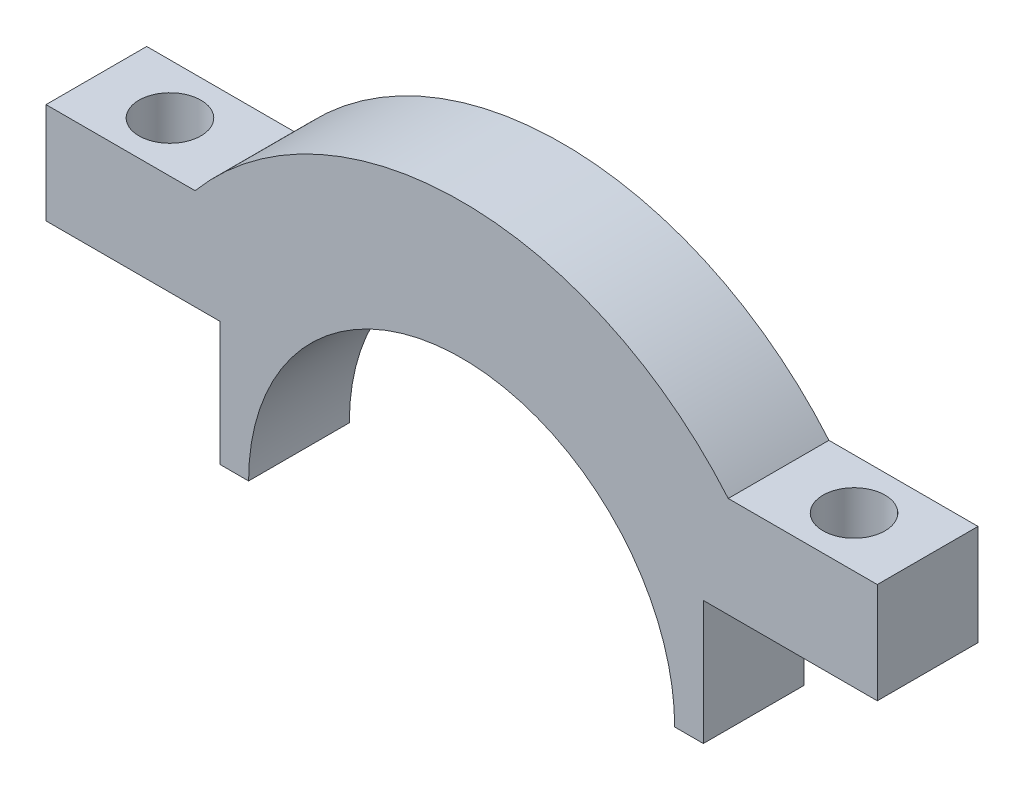
ISO-10303-21;
HEADER;
FILE_DESCRIPTION(('STEP AP214'),'2;1');
FILE_NAME('part.step','',(''),(''),'','','');
FILE_SCHEMA(('AUTOMOTIVE_DESIGN { 1 0 10303 214 1 1 1 1 }'));
ENDSEC;
DATA;
#1=APPLICATION_CONTEXT('core data for automotive mechanical design processes');
#2=APPLICATION_PROTOCOL_DEFINITION('international standard','automotive_design',2000,#1);
#3=PRODUCT_CONTEXT('',#1,'mechanical');
#4=PRODUCT('Part','Part','',(#3));
#5=PRODUCT_RELATED_PRODUCT_CATEGORY('part','',(#4));
#6=PRODUCT_DEFINITION_FORMATION('','',#4);
#7=PRODUCT_DEFINITION_CONTEXT('part definition',#1,'design');
#8=PRODUCT_DEFINITION('design','',#6,#7);
#9=PRODUCT_DEFINITION_SHAPE('','',#8);
#10=(LENGTH_UNIT() NAMED_UNIT(*) SI_UNIT(.MILLI.,.METRE.));
#11=(NAMED_UNIT(*) PLANE_ANGLE_UNIT() SI_UNIT($,.RADIAN.));
#12=(NAMED_UNIT(*) SI_UNIT($,.STERADIAN.) SOLID_ANGLE_UNIT());
#13=UNCERTAINTY_MEASURE_WITH_UNIT(LENGTH_MEASURE(1.E-05),#10,'distance_accuracy_value','');
#14=(GEOMETRIC_REPRESENTATION_CONTEXT(3) GLOBAL_UNCERTAINTY_ASSIGNED_CONTEXT((#13)) GLOBAL_UNIT_ASSIGNED_CONTEXT((#10,
#11,#12)) REPRESENTATION_CONTEXT('',''));
#15=CARTESIAN_POINT('',(0.,0.,0.));
#16=DIRECTION('',(0.,0.,1.));
#17=DIRECTION('',(1.,0.,0.));
#18=AXIS2_PLACEMENT_3D('',#15,#16,#17);
#19=CARTESIAN_POINT('',(0.,0.,-13.));
#20=DIRECTION('',(0.,0.,1.));
#21=DIRECTION('',(1.,0.,0.));
#22=AXIS2_PLACEMENT_3D('',#19,#20,#21);
#23=CYLINDRICAL_SURFACE('',#22,27.5);
#24=CARTESIAN_POINT('',(0.,0.,0.));
#25=DIRECTION('',(0.,0.,-1.));
#26=DIRECTION('',(1.,0.,0.));
#27=AXIS2_PLACEMENT_3D('',#24,#25,#26);
#28=CIRCLE('',#27,27.5);
#29=CARTESIAN_POINT('',(-27.5,0.,0.));
#30=VERTEX_POINT('',#29);
#31=CARTESIAN_POINT('',(27.5,0.,0.));
#32=VERTEX_POINT('',#31);
#33=EDGE_CURVE('E162',#30,#32,#28,.T.);
#34=ORIENTED_EDGE('',*,*,#33,.F.);
#35=DIRECTION('',(0.,0.,1.));
#36=VECTOR('',#35,1.);
#37=CARTESIAN_POINT('',(-27.5,0.,-13.));
#38=LINE('',#37,#36);
#39=CARTESIAN_POINT('',(-27.5,0.,-13.));
#40=VERTEX_POINT('',#39);
#41=EDGE_CURVE('E11',#40,#30,#38,.T.);
#42=ORIENTED_EDGE('',*,*,#41,.F.);
#43=CARTESIAN_POINT('',(0.,0.,-13.));
#44=DIRECTION('',(0.,0.,-1.));
#45=DIRECTION('',(1.,0.,0.));
#46=AXIS2_PLACEMENT_3D('',#43,#44,#45);
#47=CIRCLE('',#46,27.5);
#48=CARTESIAN_POINT('',(27.5,0.,-13.));
#49=VERTEX_POINT('',#48);
#50=EDGE_CURVE('E195',#40,#49,#47,.T.);
#51=ORIENTED_EDGE('',*,*,#50,.T.);
#52=DIRECTION('',(0.,0.,1.));
#53=VECTOR('',#52,1.);
#54=CARTESIAN_POINT('',(27.5,0.,-13.));
#55=LINE('',#54,#53);
#56=EDGE_CURVE('E44',#49,#32,#55,.T.);
#57=ORIENTED_EDGE('',*,*,#56,.T.);
#58=EDGE_LOOP('',(#34,#42,#51,#57));
#59=FACE_BOUND('',#58,.T.);
#60=ADVANCED_FACE('F41',(#59),#23,.F.);
#61=CARTESIAN_POINT('',(-27.5,0.,-13.));
#62=DIRECTION('',(0.,-1.,0.));
#63=DIRECTION('',(1.,0.,0.));
#64=AXIS2_PLACEMENT_3D('',#61,#62,#63);
#65=PLANE('',#64);
#66=DIRECTION('',(1.,0.,0.));
#67=VECTOR('',#66,1.);
#68=CARTESIAN_POINT('',(-27.5,0.,0.));
#69=LINE('',#68,#67);
#70=CARTESIAN_POINT('',(-31.2,0.,0.));
#71=VERTEX_POINT('',#70);
#72=EDGE_CURVE('E193',#71,#30,#69,.T.);
#73=ORIENTED_EDGE('',*,*,#72,.F.);
#74=DIRECTION('',(0.,0.,1.));
#75=VECTOR('',#74,1.);
#76=CARTESIAN_POINT('',(-31.2,0.,-13.));
#77=LINE('',#76,#75);
#78=CARTESIAN_POINT('',(-31.2,0.,-13.));
#79=VERTEX_POINT('',#78);
#80=EDGE_CURVE('E50',#79,#71,#77,.T.);
#81=ORIENTED_EDGE('',*,*,#80,.F.);
#82=DIRECTION('',(1.,0.,0.));
#83=VECTOR('',#82,1.);
#84=CARTESIAN_POINT('',(-27.5,0.,-13.));
#85=LINE('',#84,#83);
#86=EDGE_CURVE('E152',#79,#40,#85,.T.);
#87=ORIENTED_EDGE('',*,*,#86,.T.);
#88=ORIENTED_EDGE('',*,*,#41,.T.);
#89=EDGE_LOOP('',(#73,#81,#87,#88));
#90=FACE_BOUND('',#89,.T.);
#91=ADVANCED_FACE('F215',(#90),#65,.T.);
#92=CARTESIAN_POINT('',(-31.2,0.,-13.));
#93=DIRECTION('',(-1.,0.,0.));
#94=DIRECTION('',(0.,0.,1.));
#95=AXIS2_PLACEMENT_3D('',#92,#93,#94);
#96=PLANE('',#95);
#97=DIRECTION('',(0.,-1.,0.));
#98=VECTOR('',#97,1.);
#99=CARTESIAN_POINT('',(-31.2,0.,0.));
#100=LINE('',#99,#98);
#101=CARTESIAN_POINT('',(-31.2,16.,0.));
#102=VERTEX_POINT('',#101);
#103=EDGE_CURVE('E139',#102,#71,#100,.T.);
#104=ORIENTED_EDGE('',*,*,#103,.F.);
#105=DIRECTION('',(0.,0.,1.));
#106=VECTOR('',#105,1.);
#107=CARTESIAN_POINT('',(-31.2,16.,-13.));
#108=LINE('',#107,#106);
#109=CARTESIAN_POINT('',(-31.2,16.,-13.));
#110=VERTEX_POINT('',#109);
#111=EDGE_CURVE('E134',#110,#102,#108,.T.);
#112=ORIENTED_EDGE('',*,*,#111,.F.);
#113=DIRECTION('',(0.,-1.,0.));
#114=VECTOR('',#113,1.);
#115=CARTESIAN_POINT('',(-31.2,0.,-13.));
#116=LINE('',#115,#114);
#117=EDGE_CURVE('E137',#110,#79,#116,.T.);
#118=ORIENTED_EDGE('',*,*,#117,.T.);
#119=ORIENTED_EDGE('',*,*,#80,.T.);
#120=EDGE_LOOP('',(#104,#112,#118,#119));
#121=FACE_BOUND('',#120,.T.);
#122=ADVANCED_FACE('F136',(#121),#96,.T.);
#123=CARTESIAN_POINT('',(-31.2,16.,-13.));
#124=DIRECTION('',(0.,-1.,0.));
#125=DIRECTION('',(1.,0.,0.));
#126=AXIS2_PLACEMENT_3D('',#123,#124,#125);
#127=PLANE('',#126);
#128=CARTESIAN_POINT('',(-44.15,16.,-6.5));
#129=DIRECTION('',(0.,-1.,0.));
#130=DIRECTION('',(1.,0.,0.));
#131=AXIS2_PLACEMENT_3D('',#128,#129,#130);
#132=CIRCLE('',#131,4.00000000000001);
#133=CARTESIAN_POINT('',(-40.15,16.,-6.5));
#134=VERTEX_POINT('',#133);
#135=EDGE_CURVE('E166',#134,#134,#132,.F.);
#136=ORIENTED_EDGE('',*,*,#135,.T.);
#137=EDGE_LOOP('',(#136));
#138=FACE_BOUND('',#137,.T.);
#139=DIRECTION('',(1.,0.,0.));
#140=VECTOR('',#139,1.);
#141=CARTESIAN_POINT('',(-31.2,16.,0.));
#142=LINE('',#141,#140);
#143=CARTESIAN_POINT('',(-53.65,16.,0.));
#144=VERTEX_POINT('',#143);
#145=EDGE_CURVE('E190',#144,#102,#142,.T.);
#146=ORIENTED_EDGE('',*,*,#145,.F.);
#147=DIRECTION('',(0.,0.,1.));
#148=VECTOR('',#147,1.);
#149=CARTESIAN_POINT('',(-53.65,16.,-13.));
#150=LINE('',#149,#148);
#151=CARTESIAN_POINT('',(-53.65,16.,-13.));
#152=VERTEX_POINT('',#151);
#153=EDGE_CURVE('E144',#152,#144,#150,.T.);
#154=ORIENTED_EDGE('',*,*,#153,.F.);
#155=DIRECTION('',(1.,0.,0.));
#156=VECTOR('',#155,1.);
#157=CARTESIAN_POINT('',(-31.2,16.,-13.));
#158=LINE('',#157,#156);
#159=EDGE_CURVE('E150',#152,#110,#158,.T.);
#160=ORIENTED_EDGE('',*,*,#159,.T.);
#161=ORIENTED_EDGE('',*,*,#111,.T.);
#162=EDGE_LOOP('',(#146,#154,#160,#161));
#163=FACE_BOUND('',#162,.T.);
#164=ADVANCED_FACE('F154',(#138,#163),#127,.T.);
#165=CARTESIAN_POINT('',(-53.65,16.,-13.));
#166=DIRECTION('',(-1.,0.,0.));
#167=DIRECTION('',(0.,0.,1.));
#168=AXIS2_PLACEMENT_3D('',#165,#166,#167);
#169=PLANE('',#168);
#170=DIRECTION('',(0.,-1.,0.));
#171=VECTOR('',#170,1.);
#172=CARTESIAN_POINT('',(-53.65,16.,0.));
#173=LINE('',#172,#171);
#174=CARTESIAN_POINT('',(-53.65,29.,0.));
#175=VERTEX_POINT('',#174);
#176=EDGE_CURVE('E187',#175,#144,#173,.T.);
#177=ORIENTED_EDGE('',*,*,#176,.F.);
#178=DIRECTION('',(0.,0.,1.));
#179=VECTOR('',#178,1.);
#180=CARTESIAN_POINT('',(-53.65,29.,-13.));
#181=LINE('',#180,#179);
#182=CARTESIAN_POINT('',(-53.65,29.,-13.));
#183=VERTEX_POINT('',#182);
#184=EDGE_CURVE('E199',#183,#175,#181,.T.);
#185=ORIENTED_EDGE('',*,*,#184,.F.);
#186=DIRECTION('',(0.,-1.,0.));
#187=VECTOR('',#186,1.);
#188=CARTESIAN_POINT('',(-53.65,16.,-13.));
#189=LINE('',#188,#187);
#190=EDGE_CURVE('E155',#183,#152,#189,.T.);
#191=ORIENTED_EDGE('',*,*,#190,.T.);
#192=ORIENTED_EDGE('',*,*,#153,.T.);
#193=EDGE_LOOP('',(#177,#185,#191,#192));
#194=FACE_BOUND('',#193,.T.);
#195=ADVANCED_FACE('F228',(#194),#169,.T.);
#196=CARTESIAN_POINT('',(-53.65,29.,-13.));
#197=DIRECTION('',(0.,1.,0.));
#198=DIRECTION('',(-1.,0.,0.));
#199=AXIS2_PLACEMENT_3D('',#196,#197,#198);
#200=PLANE('',#199);
#201=CARTESIAN_POINT('',(-44.15,29.,-6.5));
#202=DIRECTION('',(0.,1.,0.));
#203=DIRECTION('',(-1.,0.,0.));
#204=AXIS2_PLACEMENT_3D('',#201,#202,#203);
#205=CIRCLE('',#204,4.00000000000001);
#206=CARTESIAN_POINT('',(-48.15,29.,-6.5));
#207=VERTEX_POINT('',#206);
#208=EDGE_CURVE('E276',#207,#207,#205,.T.);
#209=ORIENTED_EDGE('',*,*,#208,.F.);
#210=EDGE_LOOP('',(#209));
#211=FACE_BOUND('',#210,.T.);
#212=DIRECTION('',(-1.,0.,0.));
#213=VECTOR('',#212,1.);
#214=CARTESIAN_POINT('',(-53.65,29.,0.));
#215=LINE('',#214,#213);
#216=CARTESIAN_POINT('',(-34.4093010681705,29.,0.));
#217=VERTEX_POINT('',#216);
#218=EDGE_CURVE('E184',#217,#175,#215,.T.);
#219=ORIENTED_EDGE('',*,*,#218,.F.);
#220=DIRECTION('',(0.,0.,1.));
#221=VECTOR('',#220,1.);
#222=CARTESIAN_POINT('',(-34.4093010681705,29.,-13.));
#223=LINE('',#222,#221);
#224=CARTESIAN_POINT('',(-34.4093010681705,29.,-13.));
#225=VERTEX_POINT('',#224);
#226=EDGE_CURVE('E201',#225,#217,#223,.T.);
#227=ORIENTED_EDGE('',*,*,#226,.F.);
#228=DIRECTION('',(-1.,0.,0.));
#229=VECTOR('',#228,1.);
#230=CARTESIAN_POINT('',(-53.65,29.,-13.));
#231=LINE('',#230,#229);
#232=EDGE_CURVE('E157',#225,#183,#231,.T.);
#233=ORIENTED_EDGE('',*,*,#232,.T.);
#234=ORIENTED_EDGE('',*,*,#184,.T.);
#235=EDGE_LOOP('',(#219,#227,#233,#234));
#236=FACE_BOUND('',#235,.T.);
#237=ADVANCED_FACE('F232',(#211,#236),#200,.T.);
#238=CARTESIAN_POINT('',(0.,0.,-13.));
#239=DIRECTION('',(0.,0.,1.));
#240=DIRECTION('',(1.,0.,0.));
#241=AXIS2_PLACEMENT_3D('',#238,#239,#240);
#242=CYLINDRICAL_SURFACE('',#241,45.);
#243=CARTESIAN_POINT('',(0.,0.,0.));
#244=DIRECTION('',(0.,0.,1.));
#245=DIRECTION('',(1.,0.,0.));
#246=AXIS2_PLACEMENT_3D('',#243,#244,#245);
#247=CIRCLE('',#246,45.);
#248=CARTESIAN_POINT('',(34.4093010681705,29.,0.));
#249=VERTEX_POINT('',#248);
#250=EDGE_CURVE('E181',#249,#217,#247,.T.);
#251=ORIENTED_EDGE('',*,*,#250,.F.);
#252=DIRECTION('',(0.,0.,1.));
#253=VECTOR('',#252,1.);
#254=CARTESIAN_POINT('',(34.4093010681705,29.,-13.));
#255=LINE('',#254,#253);
#256=CARTESIAN_POINT('',(34.4093010681705,29.,-13.));
#257=VERTEX_POINT('',#256);
#258=EDGE_CURVE('E203',#257,#249,#255,.T.);
#259=ORIENTED_EDGE('',*,*,#258,.F.);
#260=CARTESIAN_POINT('',(0.,0.,-13.));
#261=DIRECTION('',(0.,0.,1.));
#262=DIRECTION('',(1.,0.,0.));
#263=AXIS2_PLACEMENT_3D('',#260,#261,#262);
#264=CIRCLE('',#263,45.);
#265=EDGE_CURVE('E303',#257,#225,#264,.T.);
#266=ORIENTED_EDGE('',*,*,#265,.T.);
#267=ORIENTED_EDGE('',*,*,#226,.T.);
#268=EDGE_LOOP('',(#251,#259,#266,#267));
#269=FACE_BOUND('',#268,.T.);
#270=ADVANCED_FACE('F236',(#269),#242,.T.);
#271=CARTESIAN_POINT('',(53.65,29.,-13.));
#272=DIRECTION('',(0.,1.,0.));
#273=DIRECTION('',(-1.,0.,0.));
#274=AXIS2_PLACEMENT_3D('',#271,#272,#273);
#275=PLANE('',#274);
#276=CARTESIAN_POINT('',(44.15,29.,-6.5));
#277=DIRECTION('',(0.,1.,0.));
#278=DIRECTION('',(1.,0.,0.));
#279=AXIS2_PLACEMENT_3D('',#276,#277,#278);
#280=CIRCLE('',#279,4.00000000000001);
#281=CARTESIAN_POINT('',(48.15,29.,-6.5));
#282=VERTEX_POINT('',#281);
#283=EDGE_CURVE('E280',#282,#282,#280,.T.);
#284=ORIENTED_EDGE('',*,*,#283,.F.);
#285=EDGE_LOOP('',(#284));
#286=FACE_BOUND('',#285,.T.);
#287=DIRECTION('',(-1.,0.,0.));
#288=VECTOR('',#287,1.);
#289=CARTESIAN_POINT('',(53.65,29.,0.));
#290=LINE('',#289,#288);
#291=CARTESIAN_POINT('',(53.65,29.,0.));
#292=VERTEX_POINT('',#291);
#293=EDGE_CURVE('E178',#292,#249,#290,.T.);
#294=ORIENTED_EDGE('',*,*,#293,.F.);
#295=DIRECTION('',(0.,0.,1.));
#296=VECTOR('',#295,1.);
#297=CARTESIAN_POINT('',(53.65,29.,-13.));
#298=LINE('',#297,#296);
#299=CARTESIAN_POINT('',(53.65,29.,-13.));
#300=VERTEX_POINT('',#299);
#301=EDGE_CURVE('E205',#300,#292,#298,.T.);
#302=ORIENTED_EDGE('',*,*,#301,.F.);
#303=DIRECTION('',(-1.,0.,0.));
#304=VECTOR('',#303,1.);
#305=CARTESIAN_POINT('',(53.65,29.,-13.));
#306=LINE('',#305,#304);
#307=EDGE_CURVE('E300',#300,#257,#306,.T.);
#308=ORIENTED_EDGE('',*,*,#307,.T.);
#309=ORIENTED_EDGE('',*,*,#258,.T.);
#310=EDGE_LOOP('',(#294,#302,#308,#309));
#311=FACE_BOUND('',#310,.T.);
#312=ADVANCED_FACE('F240',(#286,#311),#275,.T.);
#313=CARTESIAN_POINT('',(53.65,16.,-13.));
#314=DIRECTION('',(1.,0.,0.));
#315=DIRECTION('',(0.,0.,-1.));
#316=AXIS2_PLACEMENT_3D('',#313,#314,#315);
#317=PLANE('',#316);
#318=DIRECTION('',(0.,1.,0.));
#319=VECTOR('',#318,1.);
#320=CARTESIAN_POINT('',(53.65,16.,0.));
#321=LINE('',#320,#319);
#322=CARTESIAN_POINT('',(53.65,16.,0.));
#323=VERTEX_POINT('',#322);
#324=EDGE_CURVE('E175',#323,#292,#321,.T.);
#325=ORIENTED_EDGE('',*,*,#324,.F.);
#326=DIRECTION('',(0.,0.,1.));
#327=VECTOR('',#326,1.);
#328=CARTESIAN_POINT('',(53.65,16.,-13.));
#329=LINE('',#328,#327);
#330=CARTESIAN_POINT('',(53.65,16.,-13.));
#331=VERTEX_POINT('',#330);
#332=EDGE_CURVE('E207',#331,#323,#329,.T.);
#333=ORIENTED_EDGE('',*,*,#332,.F.);
#334=DIRECTION('',(0.,1.,0.));
#335=VECTOR('',#334,1.);
#336=CARTESIAN_POINT('',(53.65,16.,-13.));
#337=LINE('',#336,#335);
#338=EDGE_CURVE('E297',#331,#300,#337,.T.);
#339=ORIENTED_EDGE('',*,*,#338,.T.);
#340=ORIENTED_EDGE('',*,*,#301,.T.);
#341=EDGE_LOOP('',(#325,#333,#339,#340));
#342=FACE_BOUND('',#341,.T.);
#343=ADVANCED_FACE('F244',(#342),#317,.T.);
#344=CARTESIAN_POINT('',(31.2,16.,-13.));
#345=DIRECTION('',(0.,-1.,0.));
#346=DIRECTION('',(1.,0.,0.));
#347=AXIS2_PLACEMENT_3D('',#344,#345,#346);
#348=PLANE('',#347);
#349=CARTESIAN_POINT('',(44.15,16.,-6.5));
#350=DIRECTION('',(0.,-1.,0.));
#351=DIRECTION('',(1.,0.,0.));
#352=AXIS2_PLACEMENT_3D('',#349,#350,#351);
#353=CIRCLE('',#352,4.00000000000001);
#354=CARTESIAN_POINT('',(48.15,16.,-6.5));
#355=VERTEX_POINT('',#354);
#356=EDGE_CURVE('E283',#355,#355,#353,.F.);
#357=ORIENTED_EDGE('',*,*,#356,.T.);
#358=EDGE_LOOP('',(#357));
#359=FACE_BOUND('',#358,.T.);
#360=DIRECTION('',(1.,0.,0.));
#361=VECTOR('',#360,1.);
#362=CARTESIAN_POINT('',(31.2,16.,0.));
#363=LINE('',#362,#361);
#364=CARTESIAN_POINT('',(31.2,16.,0.));
#365=VERTEX_POINT('',#364);
#366=EDGE_CURVE('E172',#365,#323,#363,.T.);
#367=ORIENTED_EDGE('',*,*,#366,.F.);
#368=DIRECTION('',(0.,0.,1.));
#369=VECTOR('',#368,1.);
#370=CARTESIAN_POINT('',(31.2,16.,-13.));
#371=LINE('',#370,#369);
#372=CARTESIAN_POINT('',(31.2,16.,-13.));
#373=VERTEX_POINT('',#372);
#374=EDGE_CURVE('E209',#373,#365,#371,.T.);
#375=ORIENTED_EDGE('',*,*,#374,.F.);
#376=DIRECTION('',(1.,0.,0.));
#377=VECTOR('',#376,1.);
#378=CARTESIAN_POINT('',(31.2,16.,-13.));
#379=LINE('',#378,#377);
#380=EDGE_CURVE('E294',#373,#331,#379,.T.);
#381=ORIENTED_EDGE('',*,*,#380,.T.);
#382=ORIENTED_EDGE('',*,*,#332,.T.);
#383=EDGE_LOOP('',(#367,#375,#381,#382));
#384=FACE_BOUND('',#383,.T.);
#385=ADVANCED_FACE('F248',(#359,#384),#348,.T.);
#386=CARTESIAN_POINT('',(31.2,0.,-13.));
#387=DIRECTION('',(1.,0.,0.));
#388=DIRECTION('',(0.,0.,-1.));
#389=AXIS2_PLACEMENT_3D('',#386,#387,#388);
#390=PLANE('',#389);
#391=DIRECTION('',(0.,1.,0.));
#392=VECTOR('',#391,1.);
#393=CARTESIAN_POINT('',(31.2,0.,0.));
#394=LINE('',#393,#392);
#395=CARTESIAN_POINT('',(31.2,0.,0.));
#396=VERTEX_POINT('',#395);
#397=EDGE_CURVE('E169',#396,#365,#394,.T.);
#398=ORIENTED_EDGE('',*,*,#397,.F.);
#399=DIRECTION('',(0.,0.,1.));
#400=VECTOR('',#399,1.);
#401=CARTESIAN_POINT('',(31.2,0.,-13.));
#402=LINE('',#401,#400);
#403=CARTESIAN_POINT('',(31.2,0.,-13.));
#404=VERTEX_POINT('',#403);
#405=EDGE_CURVE('E210',#404,#396,#402,.T.);
#406=ORIENTED_EDGE('',*,*,#405,.F.);
#407=DIRECTION('',(0.,1.,0.));
#408=VECTOR('',#407,1.);
#409=CARTESIAN_POINT('',(31.2,0.,-13.));
#410=LINE('',#409,#408);
#411=EDGE_CURVE('E291',#404,#373,#410,.T.);
#412=ORIENTED_EDGE('',*,*,#411,.T.);
#413=ORIENTED_EDGE('',*,*,#374,.T.);
#414=EDGE_LOOP('',(#398,#406,#412,#413));
#415=FACE_BOUND('',#414,.T.);
#416=ADVANCED_FACE('F252',(#415),#390,.T.);
#417=CARTESIAN_POINT('',(27.5,0.,-13.));
#418=DIRECTION('',(0.,-1.,0.));
#419=DIRECTION('',(1.,0.,0.));
#420=AXIS2_PLACEMENT_3D('',#417,#418,#419);
#421=PLANE('',#420);
#422=DIRECTION('',(1.,0.,0.));
#423=VECTOR('',#422,1.);
#424=CARTESIAN_POINT('',(27.5,0.,0.));
#425=LINE('',#424,#423);
#426=EDGE_CURVE('E165',#32,#396,#425,.T.);
#427=ORIENTED_EDGE('',*,*,#426,.F.);
#428=ORIENTED_EDGE('',*,*,#56,.F.);
#429=DIRECTION('',(1.,0.,0.));
#430=VECTOR('',#429,1.);
#431=CARTESIAN_POINT('',(27.5,0.,-13.));
#432=LINE('',#431,#430);
#433=EDGE_CURVE('E289',#49,#404,#432,.T.);
#434=ORIENTED_EDGE('',*,*,#433,.T.);
#435=ORIENTED_EDGE('',*,*,#405,.T.);
#436=EDGE_LOOP('',(#427,#428,#434,#435));
#437=FACE_BOUND('',#436,.T.);
#438=ADVANCED_FACE('F212',(#437),#421,.T.);
#439=CARTESIAN_POINT('',(0.,0.,-13.));
#440=DIRECTION('',(0.,0.,1.));
#441=DIRECTION('',(1.,0.,0.));
#442=AXIS2_PLACEMENT_3D('',#439,#440,#441);
#443=PLANE('',#442);
#444=ORIENTED_EDGE('',*,*,#50,.F.);
#445=ORIENTED_EDGE('',*,*,#86,.F.);
#446=ORIENTED_EDGE('',*,*,#117,.F.);
#447=ORIENTED_EDGE('',*,*,#159,.F.);
#448=ORIENTED_EDGE('',*,*,#190,.F.);
#449=ORIENTED_EDGE('',*,*,#232,.F.);
#450=ORIENTED_EDGE('',*,*,#265,.F.);
#451=ORIENTED_EDGE('',*,*,#307,.F.);
#452=ORIENTED_EDGE('',*,*,#338,.F.);
#453=ORIENTED_EDGE('',*,*,#380,.F.);
#454=ORIENTED_EDGE('',*,*,#411,.F.);
#455=ORIENTED_EDGE('',*,*,#433,.F.);
#456=EDGE_LOOP('',(#444,#445,#446,#447,#448,#449,#450,#451,#452,#453,#454,#455));
#457=FACE_BOUND('',#456,.T.);
#458=ADVANCED_FACE('F148',(#457),#443,.F.);
#459=CARTESIAN_POINT('',(0.,0.,0.));
#460=DIRECTION('',(0.,0.,1.));
#461=DIRECTION('',(1.,0.,0.));
#462=AXIS2_PLACEMENT_3D('',#459,#460,#461);
#463=PLANE('',#462);
#464=ORIENTED_EDGE('',*,*,#33,.T.);
#465=ORIENTED_EDGE('',*,*,#426,.T.);
#466=ORIENTED_EDGE('',*,*,#397,.T.);
#467=ORIENTED_EDGE('',*,*,#366,.T.);
#468=ORIENTED_EDGE('',*,*,#324,.T.);
#469=ORIENTED_EDGE('',*,*,#293,.T.);
#470=ORIENTED_EDGE('',*,*,#250,.T.);
#471=ORIENTED_EDGE('',*,*,#218,.T.);
#472=ORIENTED_EDGE('',*,*,#176,.T.);
#473=ORIENTED_EDGE('',*,*,#145,.T.);
#474=ORIENTED_EDGE('',*,*,#103,.T.);
#475=ORIENTED_EDGE('',*,*,#72,.T.);
#476=EDGE_LOOP('',(#464,#465,#466,#467,#468,#469,#470,#471,#472,#473,#474,#475));
#477=FACE_BOUND('',#476,.T.);
#478=ADVANCED_FACE('F214',(#477),#463,.T.);
#479=CARTESIAN_POINT('',(44.15,4.68629150101524,-6.5));
#480=DIRECTION('',(0.,1.,0.));
#481=DIRECTION('',(-1.,0.,0.));
#482=AXIS2_PLACEMENT_3D('',#479,#480,#481);
#483=CYLINDRICAL_SURFACE('',#482,4.00000000000001);
#484=ORIENTED_EDGE('',*,*,#283,.T.);
#485=EDGE_LOOP('',(#484));
#486=FACE_BOUND('',#485,.T.);
#487=ORIENTED_EDGE('',*,*,#356,.F.);
#488=EDGE_LOOP('',(#487));
#489=FACE_BOUND('',#488,.T.);
#490=ADVANCED_FACE('F263',(#486,#489),#483,.F.);
#491=CARTESIAN_POINT('',(-44.15,4.6862915010152,-6.5));
#492=DIRECTION('',(0.,1.,0.));
#493=DIRECTION('',(-1.,0.,0.));
#494=AXIS2_PLACEMENT_3D('',#491,#492,#493);
#495=CYLINDRICAL_SURFACE('',#494,4.00000000000001);
#496=ORIENTED_EDGE('',*,*,#208,.T.);
#497=EDGE_LOOP('',(#496));
#498=FACE_BOUND('',#497,.T.);
#499=ORIENTED_EDGE('',*,*,#135,.F.);
#500=EDGE_LOOP('',(#499));
#501=FACE_BOUND('',#500,.T.);
#502=ADVANCED_FACE('F267',(#498,#501),#495,.F.);
#503=CLOSED_SHELL('',(#60,#91,#122,#164,#195,#237,#270,#312,#343,#385,#416,#438,#458,#478,#490,#502));
#504=MANIFOLD_SOLID_BREP('B2',#503);
#505=ADVANCED_BREP_SHAPE_REPRESENTATION('',(#18,#504),#14);
#506=SHAPE_DEFINITION_REPRESENTATION(#9,#505);
ENDSEC;
END-ISO-10303-21;
